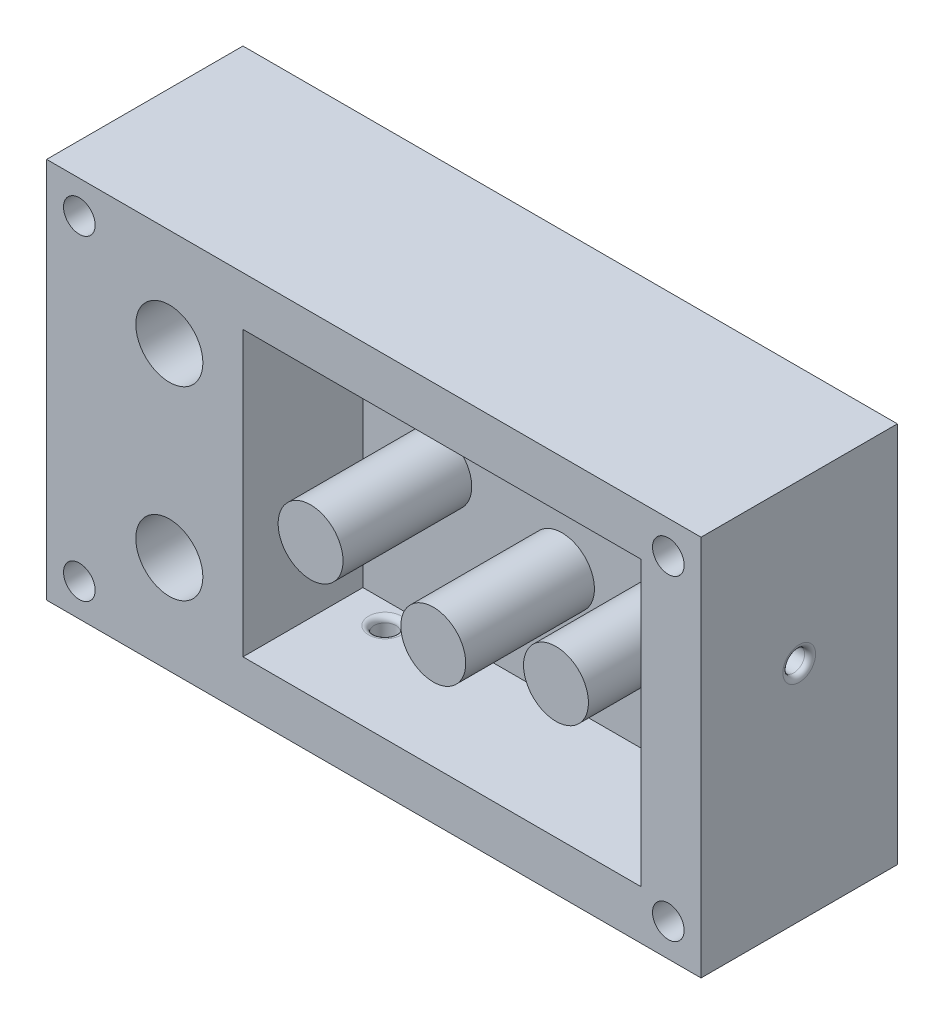
ISO-10303-21;
HEADER;
FILE_DESCRIPTION(('STEP AP214'),'2;1');
FILE_NAME('part.step','',(''),(''),'','','');
FILE_SCHEMA(('AUTOMOTIVE_DESIGN { 1 0 10303 214 1 1 1 1 }'));
ENDSEC;
DATA;
#1=APPLICATION_CONTEXT('core data for automotive mechanical design processes');
#2=APPLICATION_PROTOCOL_DEFINITION('international standard','automotive_design',2000,#1);
#3=PRODUCT_CONTEXT('',#1,'mechanical');
#4=PRODUCT('Part','Part','',(#3));
#5=PRODUCT_RELATED_PRODUCT_CATEGORY('part','',(#4));
#6=PRODUCT_DEFINITION_FORMATION('','',#4);
#7=PRODUCT_DEFINITION_CONTEXT('part definition',#1,'design');
#8=PRODUCT_DEFINITION('design','',#6,#7);
#9=PRODUCT_DEFINITION_SHAPE('','',#8);
#10=(LENGTH_UNIT() NAMED_UNIT(*) SI_UNIT(.MILLI.,.METRE.));
#11=(NAMED_UNIT(*) PLANE_ANGLE_UNIT() SI_UNIT($,.RADIAN.));
#12=(NAMED_UNIT(*) SI_UNIT($,.STERADIAN.) SOLID_ANGLE_UNIT());
#13=UNCERTAINTY_MEASURE_WITH_UNIT(LENGTH_MEASURE(1.E-05),#10,'distance_accuracy_value','');
#14=(GEOMETRIC_REPRESENTATION_CONTEXT(3) GLOBAL_UNCERTAINTY_ASSIGNED_CONTEXT((#13)) GLOBAL_UNIT_ASSIGNED_CONTEXT((#10,
#11,#12)) REPRESENTATION_CONTEXT('',''));
#15=CARTESIAN_POINT('',(0.,0.,0.));
#16=DIRECTION('',(0.,0.,1.));
#17=DIRECTION('',(1.,0.,0.));
#18=AXIS2_PLACEMENT_3D('',#15,#16,#17);
#19=CARTESIAN_POINT('',(0.,35.,18.));
#20=DIRECTION('',(0.,1.,0.));
#21=DIRECTION('',(0.,0.,1.));
#22=AXIS2_PLACEMENT_3D('',#19,#20,#21);
#23=PLANE('',#22);
#24=DIRECTION('',(1.,0.,0.));
#25=VECTOR('',#24,1.);
#26=CARTESIAN_POINT('',(0.,35.,0.));
#27=LINE('',#26,#25);
#28=CARTESIAN_POINT('',(0.,35.,0.));
#29=VERTEX_POINT('',#28);
#30=CARTESIAN_POINT('',(60.,35.,0.));
#31=VERTEX_POINT('',#30);
#32=EDGE_CURVE('E162',#29,#31,#27,.T.);
#33=ORIENTED_EDGE('',*,*,#32,.F.);
#34=DIRECTION('',(0.,0.,-1.));
#35=VECTOR('',#34,1.);
#36=CARTESIAN_POINT('',(0.,35.,18.));
#37=LINE('',#36,#35);
#38=CARTESIAN_POINT('',(0.,35.,18.));
#39=VERTEX_POINT('',#38);
#40=EDGE_CURVE('E62',#39,#29,#37,.T.);
#41=ORIENTED_EDGE('',*,*,#40,.F.);
#42=DIRECTION('',(1.,0.,0.));
#43=VECTOR('',#42,1.);
#44=CARTESIAN_POINT('',(0.,35.,18.));
#45=LINE('',#44,#43);
#46=CARTESIAN_POINT('',(60.,35.,18.));
#47=VERTEX_POINT('',#46);
#48=EDGE_CURVE('E171',#39,#47,#45,.T.);
#49=ORIENTED_EDGE('',*,*,#48,.T.);
#50=DIRECTION('',(0.,0.,-1.));
#51=VECTOR('',#50,1.);
#52=CARTESIAN_POINT('',(60.,35.,18.));
#53=LINE('',#52,#51);
#54=EDGE_CURVE('E179',#47,#31,#53,.T.);
#55=ORIENTED_EDGE('',*,*,#54,.T.);
#56=EDGE_LOOP('',(#33,#41,#49,#55));
#57=FACE_BOUND('',#56,.T.);
#58=ADVANCED_FACE('F38',(#57),#23,.T.);
#59=CARTESIAN_POINT('',(0.,0.,18.));
#60=DIRECTION('',(-1.,0.,0.));
#61=DIRECTION('',(0.,0.,1.));
#62=AXIS2_PLACEMENT_3D('',#59,#60,#61);
#63=PLANE('',#62);
#64=DIRECTION('',(0.,1.,0.));
#65=VECTOR('',#64,1.);
#66=CARTESIAN_POINT('',(0.,0.,0.));
#67=LINE('',#66,#65);
#68=CARTESIAN_POINT('',(0.,0.,0.));
#69=VERTEX_POINT('',#68);
#70=EDGE_CURVE('E173',#69,#29,#67,.T.);
#71=ORIENTED_EDGE('',*,*,#70,.F.);
#72=DIRECTION('',(0.,0.,-1.));
#73=VECTOR('',#72,1.);
#74=CARTESIAN_POINT('',(0.,0.,18.));
#75=LINE('',#74,#73);
#76=CARTESIAN_POINT('',(0.,0.,18.));
#77=VERTEX_POINT('',#76);
#78=EDGE_CURVE('E191',#77,#69,#75,.T.);
#79=ORIENTED_EDGE('',*,*,#78,.F.);
#80=DIRECTION('',(0.,1.,0.));
#81=VECTOR('',#80,1.);
#82=CARTESIAN_POINT('',(0.,0.,18.));
#83=LINE('',#82,#81);
#84=EDGE_CURVE('E177',#77,#39,#83,.T.);
#85=ORIENTED_EDGE('',*,*,#84,.T.);
#86=ORIENTED_EDGE('',*,*,#40,.T.);
#87=EDGE_LOOP('',(#71,#79,#85,#86));
#88=FACE_BOUND('',#87,.T.);
#89=ADVANCED_FACE('F295',(#88),#63,.T.);
#90=CARTESIAN_POINT('',(0.,0.,18.));
#91=DIRECTION('',(0.,1.,0.));
#92=DIRECTION('',(0.,0.,1.));
#93=AXIS2_PLACEMENT_3D('',#90,#91,#92);
#94=PLANE('',#93);
#95=CARTESIAN_POINT('',(22.025,0.,9.));
#96=DIRECTION('',(0.,1.,0.));
#97=DIRECTION('',(0.,0.,1.));
#98=AXIS2_PLACEMENT_3D('',#95,#96,#97);
#99=CIRCLE('',#98,1.5);
#100=CARTESIAN_POINT('',(22.025,0.,10.5));
#101=VERTEX_POINT('',#100);
#102=EDGE_CURVE('E11',#101,#101,#99,.T.);
#103=ORIENTED_EDGE('',*,*,#102,.T.);
#104=EDGE_LOOP('',(#103));
#105=FACE_BOUND('',#104,.T.);
#106=DIRECTION('',(1.,0.,0.));
#107=VECTOR('',#106,1.);
#108=CARTESIAN_POINT('',(0.,0.,0.));
#109=LINE('',#108,#107);
#110=CARTESIAN_POINT('',(60.,0.,0.));
#111=VERTEX_POINT('',#110);
#112=EDGE_CURVE('E185',#69,#111,#109,.T.);
#113=ORIENTED_EDGE('',*,*,#112,.T.);
#114=DIRECTION('',(0.,0.,-1.));
#115=VECTOR('',#114,1.);
#116=CARTESIAN_POINT('',(60.,0.,18.));
#117=LINE('',#116,#115);
#118=CARTESIAN_POINT('',(60.,0.,18.));
#119=VERTEX_POINT('',#118);
#120=EDGE_CURVE('E193',#119,#111,#117,.T.);
#121=ORIENTED_EDGE('',*,*,#120,.F.);
#122=DIRECTION('',(1.,0.,0.));
#123=VECTOR('',#122,1.);
#124=CARTESIAN_POINT('',(0.,0.,18.));
#125=LINE('',#124,#123);
#126=EDGE_CURVE('E175',#77,#119,#125,.T.);
#127=ORIENTED_EDGE('',*,*,#126,.F.);
#128=ORIENTED_EDGE('',*,*,#78,.T.);
#129=EDGE_LOOP('',(#113,#121,#127,#128));
#130=FACE_BOUND('',#129,.T.);
#131=ADVANCED_FACE('F300',(#105,#130),#94,.F.);
#132=CARTESIAN_POINT('',(60.,0.,18.));
#133=DIRECTION('',(-1.,0.,0.));
#134=DIRECTION('',(0.,0.,1.));
#135=AXIS2_PLACEMENT_3D('',#132,#133,#134);
#136=PLANE('',#135);
#137=CARTESIAN_POINT('',(60.,20.475,9.));
#138=DIRECTION('',(-1.,0.,0.));
#139=DIRECTION('',(0.,0.,1.));
#140=AXIS2_PLACEMENT_3D('',#137,#138,#139);
#141=CIRCLE('',#140,1.5);
#142=CARTESIAN_POINT('',(60.,20.475,10.5));
#143=VERTEX_POINT('',#142);
#144=EDGE_CURVE('E211',#143,#143,#141,.T.);
#145=ORIENTED_EDGE('',*,*,#144,.T.);
#146=EDGE_LOOP('',(#145));
#147=FACE_BOUND('',#146,.T.);
#148=DIRECTION('',(0.,1.,0.));
#149=VECTOR('',#148,1.);
#150=CARTESIAN_POINT('',(60.,0.,0.));
#151=LINE('',#150,#149);
#152=EDGE_CURVE('E182',#111,#31,#151,.T.);
#153=ORIENTED_EDGE('',*,*,#152,.T.);
#154=ORIENTED_EDGE('',*,*,#54,.F.);
#155=DIRECTION('',(0.,1.,0.));
#156=VECTOR('',#155,1.);
#157=CARTESIAN_POINT('',(60.,0.,18.));
#158=LINE('',#157,#156);
#159=EDGE_CURVE('E88',#119,#47,#158,.T.);
#160=ORIENTED_EDGE('',*,*,#159,.F.);
#161=ORIENTED_EDGE('',*,*,#120,.T.);
#162=EDGE_LOOP('',(#153,#154,#160,#161));
#163=FACE_BOUND('',#162,.T.);
#164=ADVANCED_FACE('F304',(#147,#163),#136,.F.);
#165=CARTESIAN_POINT('',(0.,0.,18.));
#166=DIRECTION('',(0.,0.,1.));
#167=DIRECTION('',(1.,0.,0.));
#168=AXIS2_PLACEMENT_3D('',#165,#166,#167);
#169=PLANE('',#168);
#170=DIRECTION('',(0.,-1.,0.));
#171=VECTOR('',#170,1.);
#172=CARTESIAN_POINT('',(18.,4.5,18.));
#173=LINE('',#172,#171);
#174=CARTESIAN_POINT('',(18.,30.5,18.));
#175=VERTEX_POINT('',#174);
#176=CARTESIAN_POINT('',(18.,4.5,18.));
#177=VERTEX_POINT('',#176);
#178=EDGE_CURVE('E53',#175,#177,#173,.T.);
#179=ORIENTED_EDGE('',*,*,#178,.F.);
#180=DIRECTION('',(-1.,0.,0.));
#181=VECTOR('',#180,1.);
#182=CARTESIAN_POINT('',(18.,30.5,18.));
#183=LINE('',#182,#181);
#184=CARTESIAN_POINT('',(54.5,30.5,18.));
#185=VERTEX_POINT('',#184);
#186=EDGE_CURVE('E121',#185,#175,#183,.T.);
#187=ORIENTED_EDGE('',*,*,#186,.F.);
#188=DIRECTION('',(0.,1.,0.));
#189=VECTOR('',#188,1.);
#190=CARTESIAN_POINT('',(54.5,4.5,18.));
#191=LINE('',#190,#189);
#192=CARTESIAN_POINT('',(54.5,4.5,18.));
#193=VERTEX_POINT('',#192);
#194=EDGE_CURVE('E126',#193,#185,#191,.T.);
#195=ORIENTED_EDGE('',*,*,#194,.F.);
#196=DIRECTION('',(1.,0.,0.));
#197=VECTOR('',#196,1.);
#198=CARTESIAN_POINT('',(18.,4.5,18.));
#199=LINE('',#198,#197);
#200=EDGE_CURVE('E132',#177,#193,#199,.T.);
#201=ORIENTED_EDGE('',*,*,#200,.F.);
#202=EDGE_LOOP('',(#179,#187,#195,#201));
#203=FACE_BOUND('',#202,.T.);
#204=CARTESIAN_POINT('',(3.,3.,18.));
#205=DIRECTION('',(0.,0.,1.));
#206=DIRECTION('',(1.,0.,0.));
#207=AXIS2_PLACEMENT_3D('',#204,#205,#206);
#208=CIRCLE('',#207,1.45);
#209=CARTESIAN_POINT('',(4.45,3.,18.));
#210=VERTEX_POINT('',#209);
#211=EDGE_CURVE('E136',#210,#210,#208,.T.);
#212=ORIENTED_EDGE('',*,*,#211,.F.);
#213=EDGE_LOOP('',(#212));
#214=FACE_BOUND('',#213,.T.);
#215=CARTESIAN_POINT('',(57.,3.,18.));
#216=DIRECTION('',(0.,0.,1.));
#217=DIRECTION('',(1.,0.,0.));
#218=AXIS2_PLACEMENT_3D('',#215,#216,#217);
#219=CIRCLE('',#218,1.45);
#220=CARTESIAN_POINT('',(58.45,3.,18.));
#221=VERTEX_POINT('',#220);
#222=EDGE_CURVE('E253',#221,#221,#219,.T.);
#223=ORIENTED_EDGE('',*,*,#222,.F.);
#224=EDGE_LOOP('',(#223));
#225=FACE_BOUND('',#224,.T.);
#226=CARTESIAN_POINT('',(57.,32.,18.));
#227=DIRECTION('',(0.,0.,1.));
#228=DIRECTION('',(1.,0.,0.));
#229=AXIS2_PLACEMENT_3D('',#226,#227,#228);
#230=CIRCLE('',#229,1.45);
#231=CARTESIAN_POINT('',(58.45,32.,18.));
#232=VERTEX_POINT('',#231);
#233=EDGE_CURVE('E158',#232,#232,#230,.T.);
#234=ORIENTED_EDGE('',*,*,#233,.F.);
#235=EDGE_LOOP('',(#234));
#236=FACE_BOUND('',#235,.T.);
#237=CARTESIAN_POINT('',(3.,32.,18.));
#238=DIRECTION('',(0.,0.,1.));
#239=DIRECTION('',(1.,0.,0.));
#240=AXIS2_PLACEMENT_3D('',#237,#238,#239);
#241=CIRCLE('',#240,1.45);
#242=CARTESIAN_POINT('',(4.45,32.,18.));
#243=VERTEX_POINT('',#242);
#244=EDGE_CURVE('E155',#243,#243,#241,.T.);
#245=ORIENTED_EDGE('',*,*,#244,.F.);
#246=EDGE_LOOP('',(#245));
#247=FACE_BOUND('',#246,.T.);
#248=CARTESIAN_POINT('',(11.25,26.,18.));
#249=DIRECTION('',(0.,0.,1.));
#250=DIRECTION('',(1.,0.,0.));
#251=AXIS2_PLACEMENT_3D('',#248,#249,#250);
#252=CIRCLE('',#251,3.075);
#253=CARTESIAN_POINT('',(14.325,26.,18.));
#254=VERTEX_POINT('',#253);
#255=EDGE_CURVE('E163',#254,#254,#252,.T.);
#256=ORIENTED_EDGE('',*,*,#255,.F.);
#257=EDGE_LOOP('',(#256));
#258=FACE_BOUND('',#257,.T.);
#259=CARTESIAN_POINT('',(11.25,9.,18.));
#260=DIRECTION('',(0.,0.,1.));
#261=DIRECTION('',(1.,0.,0.));
#262=AXIS2_PLACEMENT_3D('',#259,#260,#261);
#263=CIRCLE('',#262,3.075);
#264=CARTESIAN_POINT('',(14.325,9.,18.));
#265=VERTEX_POINT('',#264);
#266=EDGE_CURVE('E166',#265,#265,#263,.T.);
#267=ORIENTED_EDGE('',*,*,#266,.F.);
#268=EDGE_LOOP('',(#267));
#269=FACE_BOUND('',#268,.T.);
#270=ORIENTED_EDGE('',*,*,#48,.F.);
#271=ORIENTED_EDGE('',*,*,#84,.F.);
#272=ORIENTED_EDGE('',*,*,#126,.T.);
#273=ORIENTED_EDGE('',*,*,#159,.T.);
#274=EDGE_LOOP('',(#270,#271,#272,#273));
#275=FACE_BOUND('',#274,.T.);
#276=ADVANCED_FACE('F129',(#203,#214,#225,#236,#247,#258,#269,#275),#169,.T.);
#277=CARTESIAN_POINT('',(0.,0.,0.));
#278=DIRECTION('',(0.,0.,1.));
#279=DIRECTION('',(1.,0.,0.));
#280=AXIS2_PLACEMENT_3D('',#277,#278,#279);
#281=PLANE('',#280);
#282=CARTESIAN_POINT('',(11.25,26.,0.));
#283=DIRECTION('',(0.,0.,1.));
#284=DIRECTION('',(1.,0.,0.));
#285=AXIS2_PLACEMENT_3D('',#282,#283,#284);
#286=CIRCLE('',#285,3.075);
#287=CARTESIAN_POINT('',(14.325,26.,0.));
#288=VERTEX_POINT('',#287);
#289=EDGE_CURVE('E159',#288,#288,#286,.T.);
#290=ORIENTED_EDGE('',*,*,#289,.T.);
#291=EDGE_LOOP('',(#290));
#292=FACE_BOUND('',#291,.T.);
#293=CARTESIAN_POINT('',(11.25,9.,0.));
#294=DIRECTION('',(0.,0.,1.));
#295=DIRECTION('',(1.,0.,0.));
#296=AXIS2_PLACEMENT_3D('',#293,#294,#295);
#297=CIRCLE('',#296,3.075);
#298=CARTESIAN_POINT('',(14.325,9.,0.));
#299=VERTEX_POINT('',#298);
#300=EDGE_CURVE('E154',#299,#299,#297,.T.);
#301=ORIENTED_EDGE('',*,*,#300,.T.);
#302=EDGE_LOOP('',(#301));
#303=FACE_BOUND('',#302,.T.);
#304=ORIENTED_EDGE('',*,*,#32,.T.);
#305=ORIENTED_EDGE('',*,*,#152,.F.);
#306=ORIENTED_EDGE('',*,*,#112,.F.);
#307=ORIENTED_EDGE('',*,*,#70,.T.);
#308=EDGE_LOOP('',(#304,#305,#306,#307));
#309=FACE_BOUND('',#308,.T.);
#310=ADVANCED_FACE('F594',(#292,#303,#309),#281,.F.);
#311=CARTESIAN_POINT('',(11.25,9.,0.));
#312=DIRECTION('',(0.,0.,1.));
#313=DIRECTION('',(1.,0.,0.));
#314=AXIS2_PLACEMENT_3D('',#311,#312,#313);
#315=CYLINDRICAL_SURFACE('',#314,3.075);
#316=ORIENTED_EDGE('',*,*,#300,.F.);
#317=EDGE_LOOP('',(#316));
#318=FACE_BOUND('',#317,.T.);
#319=ORIENTED_EDGE('',*,*,#266,.T.);
#320=EDGE_LOOP('',(#319));
#321=FACE_BOUND('',#320,.T.);
#322=ADVANCED_FACE('F584',(#318,#321),#315,.F.);
#323=CARTESIAN_POINT('',(11.25,26.,0.));
#324=DIRECTION('',(0.,0.,1.));
#325=DIRECTION('',(1.,0.,0.));
#326=AXIS2_PLACEMENT_3D('',#323,#324,#325);
#327=CYLINDRICAL_SURFACE('',#326,3.075);
#328=ORIENTED_EDGE('',*,*,#289,.F.);
#329=EDGE_LOOP('',(#328));
#330=FACE_BOUND('',#329,.T.);
#331=ORIENTED_EDGE('',*,*,#255,.T.);
#332=EDGE_LOOP('',(#331));
#333=FACE_BOUND('',#332,.T.);
#334=ADVANCED_FACE('F574',(#330,#333),#327,.F.);
#335=CARTESIAN_POINT('',(3.,32.,7.));
#336=DIRECTION('',(0.,0.,1.));
#337=DIRECTION('',(1.,0.,0.));
#338=AXIS2_PLACEMENT_3D('',#335,#336,#337);
#339=CYLINDRICAL_SURFACE('',#338,1.45);
#340=CARTESIAN_POINT('',(3.,32.,7.));
#341=DIRECTION('',(0.,0.,1.));
#342=DIRECTION('',(1.,0.,0.));
#343=AXIS2_PLACEMENT_3D('',#340,#341,#342);
#344=CIRCLE('',#343,1.45);
#345=CARTESIAN_POINT('',(4.45,32.,7.));
#346=VERTEX_POINT('',#345);
#347=EDGE_CURVE('E151',#346,#346,#344,.T.);
#348=ORIENTED_EDGE('',*,*,#347,.F.);
#349=EDGE_LOOP('',(#348));
#350=FACE_BOUND('',#349,.T.);
#351=ORIENTED_EDGE('',*,*,#244,.T.);
#352=EDGE_LOOP('',(#351));
#353=FACE_BOUND('',#352,.T.);
#354=ADVANCED_FACE('F564',(#350,#353),#339,.F.);
#355=CARTESIAN_POINT('',(3.,32.,7.));
#356=DIRECTION('',(0.,0.,1.));
#357=DIRECTION('',(1.,0.,0.));
#358=AXIS2_PLACEMENT_3D('',#355,#356,#357);
#359=PLANE('',#358);
#360=ORIENTED_EDGE('',*,*,#347,.T.);
#361=EDGE_LOOP('',(#360));
#362=FACE_BOUND('',#361,.T.);
#363=ADVANCED_FACE('F347',(#362),#359,.T.);
#364=CARTESIAN_POINT('',(57.,32.,7.));
#365=DIRECTION('',(0.,0.,1.));
#366=DIRECTION('',(1.,0.,0.));
#367=AXIS2_PLACEMENT_3D('',#364,#365,#366);
#368=CYLINDRICAL_SURFACE('',#367,1.45);
#369=CARTESIAN_POINT('',(57.,32.,7.));
#370=DIRECTION('',(0.,0.,1.));
#371=DIRECTION('',(1.,0.,0.));
#372=AXIS2_PLACEMENT_3D('',#369,#370,#371);
#373=CIRCLE('',#372,1.45);
#374=CARTESIAN_POINT('',(58.45,32.,7.));
#375=VERTEX_POINT('',#374);
#376=EDGE_CURVE('E256',#375,#375,#373,.T.);
#377=ORIENTED_EDGE('',*,*,#376,.F.);
#378=EDGE_LOOP('',(#377));
#379=FACE_BOUND('',#378,.T.);
#380=ORIENTED_EDGE('',*,*,#233,.T.);
#381=EDGE_LOOP('',(#380));
#382=FACE_BOUND('',#381,.T.);
#383=ADVANCED_FACE('F343',(#379,#382),#368,.F.);
#384=CARTESIAN_POINT('',(57.,32.,7.));
#385=DIRECTION('',(0.,0.,1.));
#386=DIRECTION('',(1.,0.,0.));
#387=AXIS2_PLACEMENT_3D('',#384,#385,#386);
#388=PLANE('',#387);
#389=ORIENTED_EDGE('',*,*,#376,.T.);
#390=EDGE_LOOP('',(#389));
#391=FACE_BOUND('',#390,.T.);
#392=ADVANCED_FACE('F346',(#391),#388,.T.);
#393=CARTESIAN_POINT('',(57.,3.,7.));
#394=DIRECTION('',(0.,0.,1.));
#395=DIRECTION('',(1.,0.,0.));
#396=AXIS2_PLACEMENT_3D('',#393,#394,#395);
#397=CYLINDRICAL_SURFACE('',#396,1.45);
#398=CARTESIAN_POINT('',(57.,3.,7.));
#399=DIRECTION('',(0.,0.,1.));
#400=DIRECTION('',(1.,0.,0.));
#401=AXIS2_PLACEMENT_3D('',#398,#399,#400);
#402=CIRCLE('',#401,1.45);
#403=CARTESIAN_POINT('',(58.45,3.,7.));
#404=VERTEX_POINT('',#403);
#405=EDGE_CURVE('E250',#404,#404,#402,.T.);
#406=ORIENTED_EDGE('',*,*,#405,.F.);
#407=EDGE_LOOP('',(#406));
#408=FACE_BOUND('',#407,.T.);
#409=ORIENTED_EDGE('',*,*,#222,.T.);
#410=EDGE_LOOP('',(#409));
#411=FACE_BOUND('',#410,.T.);
#412=ADVANCED_FACE('F351',(#408,#411),#397,.F.);
#413=CARTESIAN_POINT('',(57.,3.,7.));
#414=DIRECTION('',(0.,0.,1.));
#415=DIRECTION('',(1.,0.,0.));
#416=AXIS2_PLACEMENT_3D('',#413,#414,#415);
#417=PLANE('',#416);
#418=ORIENTED_EDGE('',*,*,#405,.T.);
#419=EDGE_LOOP('',(#418));
#420=FACE_BOUND('',#419,.T.);
#421=ADVANCED_FACE('F355',(#420),#417,.T.);
#422=CARTESIAN_POINT('',(3.,3.,7.));
#423=DIRECTION('',(0.,0.,1.));
#424=DIRECTION('',(1.,0.,0.));
#425=AXIS2_PLACEMENT_3D('',#422,#423,#424);
#426=CYLINDRICAL_SURFACE('',#425,1.45);
#427=CARTESIAN_POINT('',(3.,3.,7.));
#428=DIRECTION('',(0.,0.,1.));
#429=DIRECTION('',(1.,0.,0.));
#430=AXIS2_PLACEMENT_3D('',#427,#428,#429);
#431=CIRCLE('',#430,1.45);
#432=CARTESIAN_POINT('',(4.45,3.,7.));
#433=VERTEX_POINT('',#432);
#434=EDGE_CURVE('E133',#433,#433,#431,.T.);
#435=ORIENTED_EDGE('',*,*,#434,.F.);
#436=EDGE_LOOP('',(#435));
#437=FACE_BOUND('',#436,.T.);
#438=ORIENTED_EDGE('',*,*,#211,.T.);
#439=EDGE_LOOP('',(#438));
#440=FACE_BOUND('',#439,.T.);
#441=ADVANCED_FACE('F359',(#437,#440),#426,.F.);
#442=CARTESIAN_POINT('',(3.,3.,7.));
#443=DIRECTION('',(0.,0.,1.));
#444=DIRECTION('',(1.,0.,0.));
#445=AXIS2_PLACEMENT_3D('',#442,#443,#444);
#446=PLANE('',#445);
#447=ORIENTED_EDGE('',*,*,#434,.T.);
#448=EDGE_LOOP('',(#447));
#449=FACE_BOUND('',#448,.T.);
#450=ADVANCED_FACE('F363',(#449),#446,.T.);
#451=CARTESIAN_POINT('',(18.,4.5,7.));
#452=DIRECTION('',(-1.,0.,0.));
#453=DIRECTION('',(0.,0.,1.));
#454=AXIS2_PLACEMENT_3D('',#451,#452,#453);
#455=PLANE('',#454);
#456=ORIENTED_EDGE('',*,*,#178,.T.);
#457=DIRECTION('',(0.,0.,1.));
#458=VECTOR('',#457,1.);
#459=CARTESIAN_POINT('',(18.,4.5,7.));
#460=LINE('',#459,#458);
#461=CARTESIAN_POINT('',(18.,4.5,7.));
#462=VERTEX_POINT('',#461);
#463=EDGE_CURVE('E144',#462,#177,#460,.T.);
#464=ORIENTED_EDGE('',*,*,#463,.F.);
#465=DIRECTION('',(0.,-1.,0.));
#466=VECTOR('',#465,1.);
#467=CARTESIAN_POINT('',(18.,4.5,7.));
#468=LINE('',#467,#466);
#469=CARTESIAN_POINT('',(18.,30.5,7.));
#470=VERTEX_POINT('',#469);
#471=EDGE_CURVE('E113',#470,#462,#468,.T.);
#472=ORIENTED_EDGE('',*,*,#471,.F.);
#473=DIRECTION('',(0.,0.,1.));
#474=VECTOR('',#473,1.);
#475=CARTESIAN_POINT('',(18.,30.5,7.));
#476=LINE('',#475,#474);
#477=EDGE_CURVE('E109',#470,#175,#476,.T.);
#478=ORIENTED_EDGE('',*,*,#477,.T.);
#479=EDGE_LOOP('',(#456,#464,#472,#478));
#480=FACE_BOUND('',#479,.T.);
#481=ADVANCED_FACE('F111',(#480),#455,.F.);
#482=CARTESIAN_POINT('',(18.,30.5,7.));
#483=DIRECTION('',(0.,1.,0.));
#484=DIRECTION('',(0.,0.,1.));
#485=AXIS2_PLACEMENT_3D('',#482,#483,#484);
#486=PLANE('',#485);
#487=ORIENTED_EDGE('',*,*,#186,.T.);
#488=ORIENTED_EDGE('',*,*,#477,.F.);
#489=DIRECTION('',(-1.,0.,0.));
#490=VECTOR('',#489,1.);
#491=CARTESIAN_POINT('',(18.,30.5,7.));
#492=LINE('',#491,#490);
#493=CARTESIAN_POINT('',(54.5,30.5,7.));
#494=VERTEX_POINT('',#493);
#495=EDGE_CURVE('E141',#494,#470,#492,.T.);
#496=ORIENTED_EDGE('',*,*,#495,.F.);
#497=DIRECTION('',(0.,0.,1.));
#498=VECTOR('',#497,1.);
#499=CARTESIAN_POINT('',(54.5,30.5,7.));
#500=LINE('',#499,#498);
#501=EDGE_CURVE('E117',#494,#185,#500,.T.);
#502=ORIENTED_EDGE('',*,*,#501,.T.);
#503=EDGE_LOOP('',(#487,#488,#496,#502));
#504=FACE_BOUND('',#503,.T.);
#505=ADVANCED_FACE('F122',(#504),#486,.F.);
#506=CARTESIAN_POINT('',(54.5,4.5,7.));
#507=DIRECTION('',(1.,0.,0.));
#508=DIRECTION('',(0.,0.,-1.));
#509=AXIS2_PLACEMENT_3D('',#506,#507,#508);
#510=PLANE('',#509);
#511=CARTESIAN_POINT('',(54.5,20.475,9.));
#512=DIRECTION('',(1.,0.,0.));
#513=DIRECTION('',(0.,0.,-1.));
#514=AXIS2_PLACEMENT_3D('',#511,#512,#513);
#515=CIRCLE('',#514,1.5);
#516=CARTESIAN_POINT('',(54.5,20.475,7.5));
#517=VERTEX_POINT('',#516);
#518=EDGE_CURVE('E214',#517,#517,#515,.T.);
#519=ORIENTED_EDGE('',*,*,#518,.T.);
#520=EDGE_LOOP('',(#519));
#521=FACE_BOUND('',#520,.T.);
#522=ORIENTED_EDGE('',*,*,#194,.T.);
#523=ORIENTED_EDGE('',*,*,#501,.F.);
#524=DIRECTION('',(0.,1.,0.));
#525=VECTOR('',#524,1.);
#526=CARTESIAN_POINT('',(54.5,4.5,7.));
#527=LINE('',#526,#525);
#528=CARTESIAN_POINT('',(54.5,4.5,7.));
#529=VERTEX_POINT('',#528);
#530=EDGE_CURVE('E143',#529,#494,#527,.T.);
#531=ORIENTED_EDGE('',*,*,#530,.F.);
#532=DIRECTION('',(0.,0.,1.));
#533=VECTOR('',#532,1.);
#534=CARTESIAN_POINT('',(54.5,4.5,7.));
#535=LINE('',#534,#533);
#536=EDGE_CURVE('E241',#529,#193,#535,.T.);
#537=ORIENTED_EDGE('',*,*,#536,.T.);
#538=EDGE_LOOP('',(#522,#523,#531,#537));
#539=FACE_BOUND('',#538,.T.);
#540=ADVANCED_FACE('F238',(#521,#539),#510,.F.);
#541=CARTESIAN_POINT('',(18.,4.5,7.));
#542=DIRECTION('',(0.,-1.,0.));
#543=DIRECTION('',(0.,0.,-1.));
#544=AXIS2_PLACEMENT_3D('',#541,#542,#543);
#545=PLANE('',#544);
#546=CARTESIAN_POINT('',(22.025,4.5,9.));
#547=DIRECTION('',(0.,-1.,0.));
#548=DIRECTION('',(0.,0.,-1.));
#549=AXIS2_PLACEMENT_3D('',#546,#547,#548);
#550=CIRCLE('',#549,1.5);
#551=CARTESIAN_POINT('',(22.025,4.5,7.5));
#552=VERTEX_POINT('',#551);
#553=EDGE_CURVE('E217',#552,#552,#550,.T.);
#554=ORIENTED_EDGE('',*,*,#553,.T.);
#555=EDGE_LOOP('',(#554));
#556=FACE_BOUND('',#555,.T.);
#557=ORIENTED_EDGE('',*,*,#200,.T.);
#558=ORIENTED_EDGE('',*,*,#536,.F.);
#559=DIRECTION('',(1.,0.,0.));
#560=VECTOR('',#559,1.);
#561=CARTESIAN_POINT('',(18.,4.5,7.));
#562=LINE('',#561,#560);
#563=EDGE_CURVE('E147',#462,#529,#562,.T.);
#564=ORIENTED_EDGE('',*,*,#563,.F.);
#565=ORIENTED_EDGE('',*,*,#463,.T.);
#566=EDGE_LOOP('',(#557,#558,#564,#565));
#567=FACE_BOUND('',#566,.T.);
#568=ADVANCED_FACE('F234',(#556,#567),#545,.F.);
#569=CARTESIAN_POINT('',(0.,0.,7.));
#570=DIRECTION('',(0.,0.,-1.));
#571=DIRECTION('',(-1.,0.,0.));
#572=AXIS2_PLACEMENT_3D('',#569,#570,#571);
#573=PLANE('',#572);
#574=CARTESIAN_POINT('',(47.5,17.5,7.));
#575=DIRECTION('',(0.,0.,-1.));
#576=DIRECTION('',(-1.,0.,0.));
#577=AXIS2_PLACEMENT_3D('',#574,#575,#576);
#578=CIRCLE('',#577,2.975);
#579=CARTESIAN_POINT('',(44.525,17.5,7.));
#580=VERTEX_POINT('',#579);
#581=EDGE_CURVE('E202',#580,#580,#578,.F.);
#582=ORIENTED_EDGE('',*,*,#581,.F.);
#583=EDGE_LOOP('',(#582));
#584=FACE_BOUND('',#583,.T.);
#585=CARTESIAN_POINT('',(36.25,15.,7.));
#586=DIRECTION('',(0.,0.,-1.));
#587=DIRECTION('',(-1.,0.,0.));
#588=AXIS2_PLACEMENT_3D('',#585,#586,#587);
#589=CIRCLE('',#588,2.975);
#590=CARTESIAN_POINT('',(33.275,15.,7.));
#591=VERTEX_POINT('',#590);
#592=EDGE_CURVE('E199',#591,#591,#589,.F.);
#593=ORIENTED_EDGE('',*,*,#592,.F.);
#594=EDGE_LOOP('',(#593));
#595=FACE_BOUND('',#594,.T.);
#596=CARTESIAN_POINT('',(25.,17.5,7.));
#597=DIRECTION('',(0.,0.,-1.));
#598=DIRECTION('',(-1.,0.,0.));
#599=AXIS2_PLACEMENT_3D('',#596,#597,#598);
#600=CIRCLE('',#599,2.975);
#601=CARTESIAN_POINT('',(22.025,17.5,7.));
#602=VERTEX_POINT('',#601);
#603=EDGE_CURVE('E190',#602,#602,#600,.F.);
#604=ORIENTED_EDGE('',*,*,#603,.F.);
#605=EDGE_LOOP('',(#604));
#606=FACE_BOUND('',#605,.T.);
#607=ORIENTED_EDGE('',*,*,#471,.T.);
#608=ORIENTED_EDGE('',*,*,#563,.T.);
#609=ORIENTED_EDGE('',*,*,#530,.T.);
#610=ORIENTED_EDGE('',*,*,#495,.T.);
#611=EDGE_LOOP('',(#607,#608,#609,#610));
#612=FACE_BOUND('',#611,.T.);
#613=ADVANCED_FACE('F237',(#584,#595,#606,#612),#573,.F.);
#614=CARTESIAN_POINT('',(25.,17.5,18.8));
#615=DIRECTION('',(0.,0.,-1.));
#616=DIRECTION('',(-1.,0.,0.));
#617=AXIS2_PLACEMENT_3D('',#614,#615,#616);
#618=CYLINDRICAL_SURFACE('',#617,2.975);
#619=CARTESIAN_POINT('',(25.,17.5,18.8));
#620=DIRECTION('',(0.,0.,1.));
#621=DIRECTION('',(1.,0.,0.));
#622=AXIS2_PLACEMENT_3D('',#619,#620,#621);
#623=CIRCLE('',#622,2.975);
#624=CARTESIAN_POINT('',(27.975,17.5,18.8));
#625=VERTEX_POINT('',#624);
#626=EDGE_CURVE('E118',#625,#625,#623,.T.);
#627=ORIENTED_EDGE('',*,*,#626,.F.);
#628=EDGE_LOOP('',(#627));
#629=FACE_BOUND('',#628,.T.);
#630=ORIENTED_EDGE('',*,*,#603,.T.);
#631=EDGE_LOOP('',(#630));
#632=FACE_BOUND('',#631,.T.);
#633=ADVANCED_FACE('F281',(#629,#632),#618,.T.);
#634=CARTESIAN_POINT('',(25.,17.5,18.8));
#635=DIRECTION('',(0.,0.,1.));
#636=DIRECTION('',(1.,0.,0.));
#637=AXIS2_PLACEMENT_3D('',#634,#635,#636);
#638=PLANE('',#637);
#639=ORIENTED_EDGE('',*,*,#626,.T.);
#640=EDGE_LOOP('',(#639));
#641=FACE_BOUND('',#640,.T.);
#642=ADVANCED_FACE('F332',(#641),#638,.T.);
#643=CARTESIAN_POINT('',(36.25,15.,18.8));
#644=DIRECTION('',(0.,0.,-1.));
#645=DIRECTION('',(-1.,0.,0.));
#646=AXIS2_PLACEMENT_3D('',#643,#644,#645);
#647=CYLINDRICAL_SURFACE('',#646,2.975);
#648=CARTESIAN_POINT('',(36.25,15.,18.8));
#649=DIRECTION('',(0.,0.,1.));
#650=DIRECTION('',(1.,0.,0.));
#651=AXIS2_PLACEMENT_3D('',#648,#649,#650);
#652=CIRCLE('',#651,2.975);
#653=CARTESIAN_POINT('',(39.225,15.,18.8));
#654=VERTEX_POINT('',#653);
#655=EDGE_CURVE('E263',#654,#654,#652,.T.);
#656=ORIENTED_EDGE('',*,*,#655,.F.);
#657=EDGE_LOOP('',(#656));
#658=FACE_BOUND('',#657,.T.);
#659=ORIENTED_EDGE('',*,*,#592,.T.);
#660=EDGE_LOOP('',(#659));
#661=FACE_BOUND('',#660,.T.);
#662=ADVANCED_FACE('F329',(#658,#661),#647,.T.);
#663=CARTESIAN_POINT('',(36.25,15.,18.8));
#664=DIRECTION('',(0.,0.,1.));
#665=DIRECTION('',(1.,0.,0.));
#666=AXIS2_PLACEMENT_3D('',#663,#664,#665);
#667=PLANE('',#666);
#668=ORIENTED_EDGE('',*,*,#655,.T.);
#669=EDGE_LOOP('',(#668));
#670=FACE_BOUND('',#669,.T.);
#671=ADVANCED_FACE('F275',(#670),#667,.T.);
#672=CARTESIAN_POINT('',(47.5,17.5,18.8));
#673=DIRECTION('',(0.,0.,-1.));
#674=DIRECTION('',(-1.,0.,0.));
#675=AXIS2_PLACEMENT_3D('',#672,#673,#674);
#676=CYLINDRICAL_SURFACE('',#675,2.975);
#677=CARTESIAN_POINT('',(47.5,17.5,18.8));
#678=DIRECTION('',(0.,0.,1.));
#679=DIRECTION('',(1.,0.,0.));
#680=AXIS2_PLACEMENT_3D('',#677,#678,#679);
#681=CIRCLE('',#680,2.975);
#682=CARTESIAN_POINT('',(50.475,17.5,18.8));
#683=VERTEX_POINT('',#682);
#684=EDGE_CURVE('E266',#683,#683,#681,.T.);
#685=ORIENTED_EDGE('',*,*,#684,.F.);
#686=EDGE_LOOP('',(#685));
#687=FACE_BOUND('',#686,.T.);
#688=ORIENTED_EDGE('',*,*,#581,.T.);
#689=EDGE_LOOP('',(#688));
#690=FACE_BOUND('',#689,.T.);
#691=ADVANCED_FACE('F272',(#687,#690),#676,.T.);
#692=CARTESIAN_POINT('',(47.5,17.5,18.8));
#693=DIRECTION('',(0.,0.,1.));
#694=DIRECTION('',(1.,0.,0.));
#695=AXIS2_PLACEMENT_3D('',#692,#693,#694);
#696=PLANE('',#695);
#697=ORIENTED_EDGE('',*,*,#684,.T.);
#698=EDGE_LOOP('',(#697));
#699=FACE_BOUND('',#698,.T.);
#700=ADVANCED_FACE('F270',(#699),#696,.T.);
#701=CARTESIAN_POINT('',(54.2,20.475,9.));
#702=DIRECTION('',(1.,0.,0.));
#703=DIRECTION('',(0.,0.,-1.));
#704=AXIS2_PLACEMENT_3D('',#701,#702,#703);
#705=CYLINDRICAL_SURFACE('',#704,1.);
#706=CARTESIAN_POINT('',(59.5,20.475,9.));
#707=DIRECTION('',(-1.,0.,0.));
#708=DIRECTION('',(0.,0.,1.));
#709=AXIS2_PLACEMENT_3D('',#706,#707,#708);
#710=CIRCLE('',#709,1.);
#711=CARTESIAN_POINT('',(59.5,20.475,10.));
#712=VERTEX_POINT('',#711);
#713=EDGE_CURVE('E208',#712,#712,#710,.F.);
#714=ORIENTED_EDGE('',*,*,#713,.T.);
#715=EDGE_LOOP('',(#714));
#716=FACE_BOUND('',#715,.T.);
#717=CARTESIAN_POINT('',(55.,20.475,9.));
#718=DIRECTION('',(1.,0.,0.));
#719=DIRECTION('',(0.,0.,-1.));
#720=AXIS2_PLACEMENT_3D('',#717,#718,#719);
#721=CIRCLE('',#720,1.);
#722=CARTESIAN_POINT('',(55.,20.475,8.));
#723=VERTEX_POINT('',#722);
#724=EDGE_CURVE('E205',#723,#723,#721,.F.);
#725=ORIENTED_EDGE('',*,*,#724,.T.);
#726=EDGE_LOOP('',(#725));
#727=FACE_BOUND('',#726,.T.);
#728=ADVANCED_FACE('F318',(#716,#727),#705,.F.);
#729=CARTESIAN_POINT('',(22.025,5.8,9.));
#730=DIRECTION('',(0.,-1.,0.));
#731=DIRECTION('',(0.,0.,-1.));
#732=AXIS2_PLACEMENT_3D('',#729,#730,#731);
#733=CYLINDRICAL_SURFACE('',#732,1.);
#734=CARTESIAN_POINT('',(22.025,4.,9.));
#735=DIRECTION('',(0.,-1.,0.));
#736=DIRECTION('',(0.,0.,-1.));
#737=AXIS2_PLACEMENT_3D('',#734,#735,#736);
#738=CIRCLE('',#737,1.);
#739=CARTESIAN_POINT('',(22.025,4.,8.));
#740=VERTEX_POINT('',#739);
#741=EDGE_CURVE('E46',#740,#740,#738,.F.);
#742=ORIENTED_EDGE('',*,*,#741,.T.);
#743=EDGE_LOOP('',(#742));
#744=FACE_BOUND('',#743,.T.);
#745=CARTESIAN_POINT('',(22.025,0.5,9.));
#746=DIRECTION('',(0.,1.,0.));
#747=DIRECTION('',(0.,0.,1.));
#748=AXIS2_PLACEMENT_3D('',#745,#746,#747);
#749=CIRCLE('',#748,1.);
#750=CARTESIAN_POINT('',(22.025,0.5,10.));
#751=VERTEX_POINT('',#750);
#752=EDGE_CURVE('E220',#751,#751,#749,.F.);
#753=ORIENTED_EDGE('',*,*,#752,.T.);
#754=EDGE_LOOP('',(#753));
#755=FACE_BOUND('',#754,.T.);
#756=ADVANCED_FACE('F225',(#744,#755),#733,.F.);
#757=CARTESIAN_POINT('',(59.5,20.475,9.));
#758=DIRECTION('',(-1.,0.,0.));
#759=DIRECTION('',(0.,0.,1.));
#760=AXIS2_PLACEMENT_3D('',#757,#758,#759);
#761=TOROIDAL_SURFACE('',#760,1.5,0.5);
#762=ORIENTED_EDGE('',*,*,#144,.F.);
#763=EDGE_LOOP('',(#762));
#764=FACE_BOUND('',#763,.T.);
#765=ORIENTED_EDGE('',*,*,#713,.F.);
#766=EDGE_LOOP('',(#765));
#767=FACE_BOUND('',#766,.T.);
#768=ADVANCED_FACE('F306',(#764,#767),#761,.T.);
#769=CARTESIAN_POINT('',(55.,20.475,9.));
#770=DIRECTION('',(1.,0.,0.));
#771=DIRECTION('',(0.,0.,-1.));
#772=AXIS2_PLACEMENT_3D('',#769,#770,#771);
#773=TOROIDAL_SURFACE('',#772,1.5,0.5);
#774=ORIENTED_EDGE('',*,*,#724,.F.);
#775=EDGE_LOOP('',(#774));
#776=FACE_BOUND('',#775,.T.);
#777=ORIENTED_EDGE('',*,*,#518,.F.);
#778=EDGE_LOOP('',(#777));
#779=FACE_BOUND('',#778,.T.);
#780=ADVANCED_FACE('F231',(#776,#779),#773,.T.);
#781=CARTESIAN_POINT('',(22.025,4.,9.));
#782=DIRECTION('',(0.,-1.,0.));
#783=DIRECTION('',(0.,0.,-1.));
#784=AXIS2_PLACEMENT_3D('',#781,#782,#783);
#785=TOROIDAL_SURFACE('',#784,1.5,0.5);
#786=ORIENTED_EDGE('',*,*,#741,.F.);
#787=EDGE_LOOP('',(#786));
#788=FACE_BOUND('',#787,.T.);
#789=ORIENTED_EDGE('',*,*,#553,.F.);
#790=EDGE_LOOP('',(#789));
#791=FACE_BOUND('',#790,.T.);
#792=ADVANCED_FACE('F228',(#788,#791),#785,.T.);
#793=CARTESIAN_POINT('',(22.025,0.5,9.));
#794=DIRECTION('',(0.,1.,0.));
#795=DIRECTION('',(0.,0.,1.));
#796=AXIS2_PLACEMENT_3D('',#793,#794,#795);
#797=TOROIDAL_SURFACE('',#796,1.5,0.5);
#798=ORIENTED_EDGE('',*,*,#102,.F.);
#799=EDGE_LOOP('',(#798));
#800=FACE_BOUND('',#799,.T.);
#801=ORIENTED_EDGE('',*,*,#752,.F.);
#802=EDGE_LOOP('',(#801));
#803=FACE_BOUND('',#802,.T.);
#804=ADVANCED_FACE('F40',(#800,#803),#797,.T.);
#805=CLOSED_SHELL('',(#58,#89,#131,#164,#276,#310,#322,#334,#354,#363,#383,#392,#412,#421,#441,
#450,#481,#505,#540,#568,#613,#633,#642,#662,#671,#691,#700,#728,#756,#768,#780,#792,#804));
#806=MANIFOLD_SOLID_BREP('B2',#805);
#807=ADVANCED_BREP_SHAPE_REPRESENTATION('',(#18,#806),#14);
#808=SHAPE_DEFINITION_REPRESENTATION(#9,#807);
ENDSEC;
END-ISO-10303-21;
